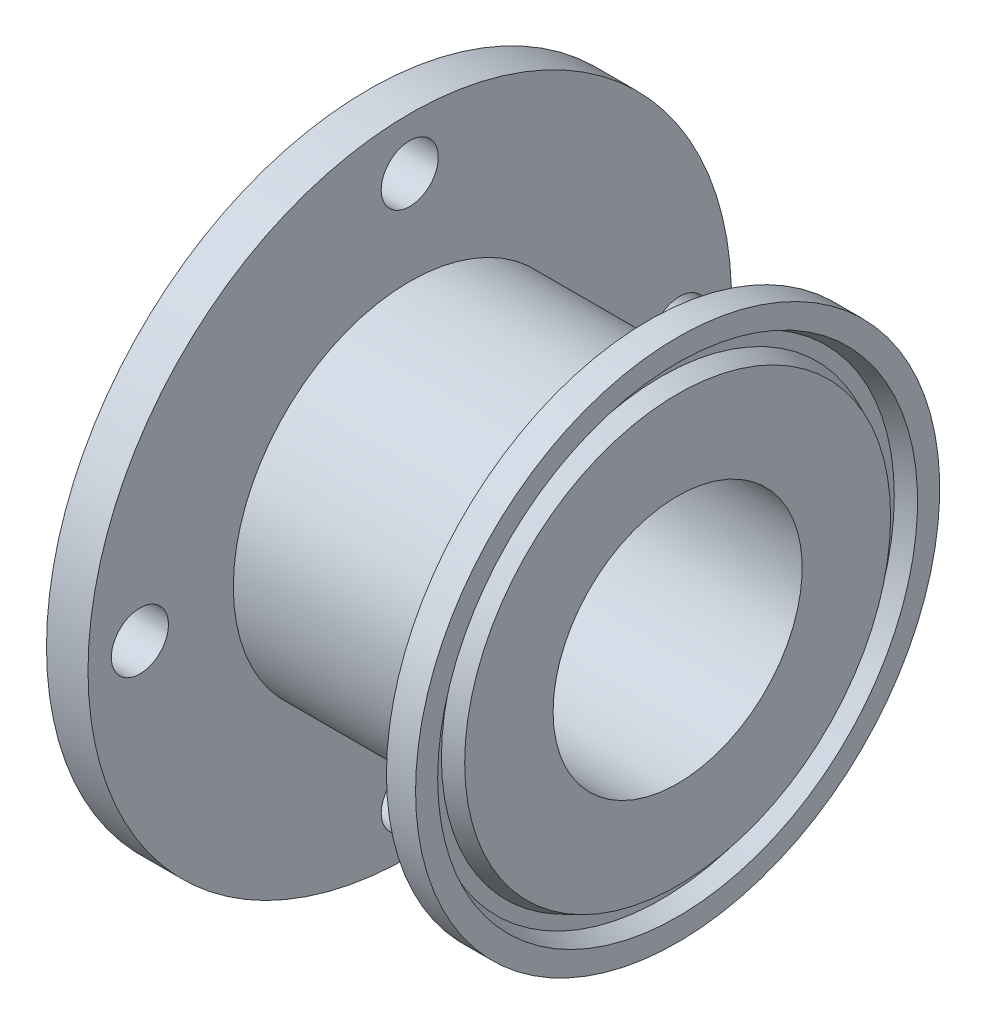
ISO-10303-21;
HEADER;
FILE_DESCRIPTION(('STEP AP214'),'2;1');
FILE_NAME('part.step','',(''),(''),'','','');
FILE_SCHEMA(('AUTOMOTIVE_DESIGN { 1 0 10303 214 1 1 1 1 }'));
ENDSEC;
DATA;
#1=APPLICATION_CONTEXT('core data for automotive mechanical design processes');
#2=APPLICATION_PROTOCOL_DEFINITION('international standard','automotive_design',2000,#1);
#3=PRODUCT_CONTEXT('',#1,'mechanical');
#4=PRODUCT('Part','Part','',(#3));
#5=PRODUCT_RELATED_PRODUCT_CATEGORY('part','',(#4));
#6=PRODUCT_DEFINITION_FORMATION('','',#4);
#7=PRODUCT_DEFINITION_CONTEXT('part definition',#1,'design');
#8=PRODUCT_DEFINITION('design','',#6,#7);
#9=PRODUCT_DEFINITION_SHAPE('','',#8);
#10=(LENGTH_UNIT() NAMED_UNIT(*) SI_UNIT(.MILLI.,.METRE.));
#11=(NAMED_UNIT(*) PLANE_ANGLE_UNIT() SI_UNIT($,.RADIAN.));
#12=(NAMED_UNIT(*) SI_UNIT($,.STERADIAN.) SOLID_ANGLE_UNIT());
#13=UNCERTAINTY_MEASURE_WITH_UNIT(LENGTH_MEASURE(1.E-05),#10,'distance_accuracy_value','');
#14=(GEOMETRIC_REPRESENTATION_CONTEXT(3) GLOBAL_UNCERTAINTY_ASSIGNED_CONTEXT((#13)) GLOBAL_UNIT_ASSIGNED_CONTEXT((#10,
#11,#12)) REPRESENTATION_CONTEXT('',''));
#15=CARTESIAN_POINT('',(0.,0.,0.));
#16=DIRECTION('',(0.,0.,1.));
#17=DIRECTION('',(1.,0.,0.));
#18=AXIS2_PLACEMENT_3D('',#15,#16,#17);
#19=CARTESIAN_POINT('',(-10.9047272163481,31.,0.));
#20=DIRECTION('',(-1.,0.,0.));
#21=DIRECTION('',(0.,0.,1.));
#22=AXIS2_PLACEMENT_3D('',#19,#20,#21);
#23=PLANE('',#22);
#24=CARTESIAN_POINT('',(-10.9047272163481,0.,0.));
#25=DIRECTION('',(-1.,0.,0.));
#26=DIRECTION('',(0.,0.,1.));
#27=AXIS2_PLACEMENT_3D('',#24,#25,#26);
#28=CIRCLE('',#27,31.);
#29=CARTESIAN_POINT('',(-10.9047272163481,0.,31.));
#30=VERTEX_POINT('',#29);
#31=EDGE_CURVE('E76',#30,#30,#28,.T.);
#32=ORIENTED_EDGE('',*,*,#31,.F.);
#33=EDGE_LOOP('',(#32));
#34=FACE_BOUND('',#33,.T.);
#35=CARTESIAN_POINT('',(-10.9047272163481,0.,0.));
#36=DIRECTION('',(-1.,0.,0.));
#37=DIRECTION('',(0.,0.,1.));
#38=AXIS2_PLACEMENT_3D('',#35,#36,#37);
#39=CIRCLE('',#38,17.);
#40=CARTESIAN_POINT('',(-10.9047272163481,0.,17.));
#41=VERTEX_POINT('',#40);
#42=EDGE_CURVE('E73',#41,#41,#39,.T.);
#43=ORIENTED_EDGE('',*,*,#42,.T.);
#44=EDGE_LOOP('',(#43));
#45=FACE_BOUND('',#44,.T.);
#46=CARTESIAN_POINT('',(-10.9047272163481,2.97940280550596E-12,25.9999999999998));
#47=DIRECTION('',(-1.,0.,0.));
#48=DIRECTION('',(0.,0.,1.));
#49=AXIS2_PLACEMENT_3D('',#46,#47,#48);
#50=CIRCLE('',#49,2.74999999999999);
#51=CARTESIAN_POINT('',(-10.9047272163481,2.97940280550596E-12,28.7499999999998));
#52=VERTEX_POINT('',#51);
#53=EDGE_CURVE('E85',#52,#52,#50,.F.);
#54=ORIENTED_EDGE('',*,*,#53,.F.);
#55=EDGE_LOOP('',(#54));
#56=FACE_BOUND('',#55,.T.);
#57=CARTESIAN_POINT('',(-10.9047272163481,-25.9999999999998,2.88862429069604E-12));
#58=DIRECTION('',(-1.,0.,0.));
#59=DIRECTION('',(0.,0.,1.));
#60=AXIS2_PLACEMENT_3D('',#57,#58,#59);
#61=CIRCLE('',#60,2.75);
#62=CARTESIAN_POINT('',(-10.9047272163481,-25.9999999999998,2.75000000000288));
#63=VERTEX_POINT('',#62);
#64=EDGE_CURVE('E89',#63,#63,#61,.F.);
#65=ORIENTED_EDGE('',*,*,#64,.F.);
#66=EDGE_LOOP('',(#65));
#67=FACE_BOUND('',#66,.T.);
#68=CARTESIAN_POINT('',(-10.9047272163481,-2.97940280550596E-12,-25.9999999999998));
#69=DIRECTION('',(-1.,0.,0.));
#70=DIRECTION('',(0.,0.,1.));
#71=AXIS2_PLACEMENT_3D('',#68,#69,#70);
#72=CIRCLE('',#71,2.74999999999999);
#73=CARTESIAN_POINT('',(-10.9047272163481,-2.97940280550596E-12,-23.2499999999998));
#74=VERTEX_POINT('',#73);
#75=EDGE_CURVE('E95',#74,#74,#72,.F.);
#76=ORIENTED_EDGE('',*,*,#75,.F.);
#77=EDGE_LOOP('',(#76));
#78=FACE_BOUND('',#77,.T.);
#79=CARTESIAN_POINT('',(-10.9047272163481,25.9999999999998,-2.70706726107619E-12));
#80=DIRECTION('',(-1.,0.,0.));
#81=DIRECTION('',(0.,0.,1.));
#82=AXIS2_PLACEMENT_3D('',#79,#80,#81);
#83=CIRCLE('',#82,2.75);
#84=CARTESIAN_POINT('',(-10.9047272163481,25.9999999999998,2.74999999999729));
#85=VERTEX_POINT('',#84);
#86=EDGE_CURVE('E101',#85,#85,#83,.F.);
#87=ORIENTED_EDGE('',*,*,#86,.F.);
#88=EDGE_LOOP('',(#87));
#89=FACE_BOUND('',#88,.T.);
#90=ADVANCED_FACE('F38',(#34,#45,#56,#67,#78,#89),#23,.F.);
#91=CARTESIAN_POINT('',(0.,0.,0.));
#92=DIRECTION('',(-1.,0.,0.));
#93=DIRECTION('',(0.,0.,1.));
#94=AXIS2_PLACEMENT_3D('',#91,#92,#93);
#95=CYLINDRICAL_SURFACE('',#94,12.);
#96=CARTESIAN_POINT('',(14.9047272163481,0.,0.));
#97=DIRECTION('',(-1.,0.,0.));
#98=DIRECTION('',(0.,0.,1.));
#99=AXIS2_PLACEMENT_3D('',#96,#97,#98);
#100=CIRCLE('',#99,12.);
#101=CARTESIAN_POINT('',(14.9047272163481,0.,12.));
#102=VERTEX_POINT('',#101);
#103=EDGE_CURVE('E10',#102,#102,#100,.T.);
#104=ORIENTED_EDGE('',*,*,#103,.F.);
#105=EDGE_LOOP('',(#104));
#106=FACE_BOUND('',#105,.T.);
#107=CARTESIAN_POINT('',(-14.9047272163481,0.,0.));
#108=DIRECTION('',(-1.,0.,0.));
#109=DIRECTION('',(0.,0.,1.));
#110=AXIS2_PLACEMENT_3D('',#107,#108,#109);
#111=CIRCLE('',#110,12.);
#112=CARTESIAN_POINT('',(-14.9047272163481,0.,12.));
#113=VERTEX_POINT('',#112);
#114=EDGE_CURVE('E82',#113,#113,#111,.T.);
#115=ORIENTED_EDGE('',*,*,#114,.T.);
#116=EDGE_LOOP('',(#115));
#117=FACE_BOUND('',#116,.T.);
#118=ADVANCED_FACE('F40',(#106,#117),#95,.F.);
#119=CARTESIAN_POINT('',(14.9047272163481,20.5186,0.));
#120=DIRECTION('',(-1.,0.,0.));
#121=DIRECTION('',(0.,0.,1.));
#122=AXIS2_PLACEMENT_3D('',#119,#120,#121);
#123=PLANE('',#122);
#124=CARTESIAN_POINT('',(14.9047272163481,0.,0.));
#125=DIRECTION('',(-1.,0.,0.));
#126=DIRECTION('',(0.,0.,1.));
#127=AXIS2_PLACEMENT_3D('',#124,#125,#126);
#128=CIRCLE('',#127,20.5186);
#129=CARTESIAN_POINT('',(14.9047272163481,0.,20.5186));
#130=VERTEX_POINT('',#129);
#131=EDGE_CURVE('E45',#130,#130,#128,.T.);
#132=ORIENTED_EDGE('',*,*,#131,.F.);
#133=EDGE_LOOP('',(#132));
#134=FACE_BOUND('',#133,.T.);
#135=ORIENTED_EDGE('',*,*,#103,.T.);
#136=EDGE_LOOP('',(#135));
#137=FACE_BOUND('',#136,.T.);
#138=ADVANCED_FACE('F119',(#134,#137),#123,.F.);
#139=CARTESIAN_POINT('',(14.9047272163481,0.,0.));
#140=DIRECTION('',(-1.,0.,0.));
#141=DIRECTION('',(0.,0.,1.));
#142=AXIS2_PLACEMENT_3D('',#139,#140,#141);
#143=CONICAL_SURFACE('',#142,20.5186,0.401425727958693);
#144=CARTESIAN_POINT('',(13.3299272163481,0.,0.));
#145=DIRECTION('',(-1.,0.,0.));
#146=DIRECTION('',(0.,0.,1.));
#147=AXIS2_PLACEMENT_3D('',#144,#145,#146);
#148=CIRCLE('',#147,21.1870629405669);
#149=CARTESIAN_POINT('',(13.3299272163481,0.,21.1870629405669));
#150=VERTEX_POINT('',#149);
#151=EDGE_CURVE('E49',#150,#150,#148,.T.);
#152=ORIENTED_EDGE('',*,*,#151,.F.);
#153=EDGE_LOOP('',(#152));
#154=FACE_BOUND('',#153,.T.);
#155=ORIENTED_EDGE('',*,*,#131,.T.);
#156=EDGE_LOOP('',(#155));
#157=FACE_BOUND('',#156,.T.);
#158=ADVANCED_FACE('F154',(#154,#157),#143,.T.);
#159=CARTESIAN_POINT('',(13.3299272163481,22.4501370594331,0.));
#160=DIRECTION('',(-1.,0.,0.));
#161=DIRECTION('',(0.,0.,1.));
#162=AXIS2_PLACEMENT_3D('',#159,#160,#161);
#163=PLANE('',#162);
#164=CARTESIAN_POINT('',(13.3299272163481,0.,0.));
#165=DIRECTION('',(-1.,0.,0.));
#166=DIRECTION('',(0.,0.,1.));
#167=AXIS2_PLACEMENT_3D('',#164,#165,#166);
#168=CIRCLE('',#167,22.4501370594331);
#169=CARTESIAN_POINT('',(13.3299272163481,0.,22.4501370594331));
#170=VERTEX_POINT('',#169);
#171=EDGE_CURVE('E53',#170,#170,#168,.T.);
#172=ORIENTED_EDGE('',*,*,#171,.F.);
#173=EDGE_LOOP('',(#172));
#174=FACE_BOUND('',#173,.T.);
#175=ORIENTED_EDGE('',*,*,#151,.T.);
#176=EDGE_LOOP('',(#175));
#177=FACE_BOUND('',#176,.T.);
#178=ADVANCED_FACE('F150',(#174,#177),#163,.F.);
#179=CARTESIAN_POINT('',(13.3299272163481,0.,0.));
#180=DIRECTION('',(1.,0.,0.));
#181=DIRECTION('',(0.,0.,-1.));
#182=AXIS2_PLACEMENT_3D('',#179,#180,#181);
#183=CONICAL_SURFACE('',#182,22.4501370594331,0.401425727958693);
#184=CARTESIAN_POINT('',(14.9047272163481,0.,0.));
#185=DIRECTION('',(-1.,0.,0.));
#186=DIRECTION('',(0.,0.,1.));
#187=AXIS2_PLACEMENT_3D('',#184,#185,#186);
#188=CIRCLE('',#187,23.1186);
#189=CARTESIAN_POINT('',(14.9047272163481,0.,23.1186));
#190=VERTEX_POINT('',#189);
#191=EDGE_CURVE('E58',#190,#190,#188,.T.);
#192=ORIENTED_EDGE('',*,*,#191,.F.);
#193=EDGE_LOOP('',(#192));
#194=FACE_BOUND('',#193,.T.);
#195=ORIENTED_EDGE('',*,*,#171,.T.);
#196=EDGE_LOOP('',(#195));
#197=FACE_BOUND('',#196,.T.);
#198=ADVANCED_FACE('F146',(#194,#197),#183,.F.);
#199=CARTESIAN_POINT('',(14.9047272163481,25.25,0.));
#200=DIRECTION('',(-1.,0.,0.));
#201=DIRECTION('',(0.,0.,1.));
#202=AXIS2_PLACEMENT_3D('',#199,#200,#201);
#203=PLANE('',#202);
#204=CARTESIAN_POINT('',(14.9047272163481,0.,0.));
#205=DIRECTION('',(-1.,0.,0.));
#206=DIRECTION('',(0.,0.,1.));
#207=AXIS2_PLACEMENT_3D('',#204,#205,#206);
#208=CIRCLE('',#207,25.25);
#209=CARTESIAN_POINT('',(14.9047272163481,0.,25.25));
#210=VERTEX_POINT('',#209);
#211=EDGE_CURVE('E61',#210,#210,#208,.T.);
#212=ORIENTED_EDGE('',*,*,#211,.F.);
#213=EDGE_LOOP('',(#212));
#214=FACE_BOUND('',#213,.T.);
#215=ORIENTED_EDGE('',*,*,#191,.T.);
#216=EDGE_LOOP('',(#215));
#217=FACE_BOUND('',#216,.T.);
#218=ADVANCED_FACE('F142',(#214,#217),#203,.F.);
#219=CARTESIAN_POINT('',(0.,0.,0.));
#220=DIRECTION('',(-1.,0.,0.));
#221=DIRECTION('',(0.,0.,1.));
#222=AXIS2_PLACEMENT_3D('',#219,#220,#221);
#223=CYLINDRICAL_SURFACE('',#222,25.25);
#224=CARTESIAN_POINT('',(12.0980272163481,0.,0.));
#225=DIRECTION('',(-1.,0.,0.));
#226=DIRECTION('',(0.,0.,1.));
#227=AXIS2_PLACEMENT_3D('',#224,#225,#226);
#228=CIRCLE('',#227,25.25);
#229=CARTESIAN_POINT('',(12.0980272163481,0.,25.25));
#230=VERTEX_POINT('',#229);
#231=EDGE_CURVE('E64',#230,#230,#228,.T.);
#232=ORIENTED_EDGE('',*,*,#231,.F.);
#233=EDGE_LOOP('',(#232));
#234=FACE_BOUND('',#233,.T.);
#235=ORIENTED_EDGE('',*,*,#211,.T.);
#236=EDGE_LOOP('',(#235));
#237=FACE_BOUND('',#236,.T.);
#238=ADVANCED_FACE('F138',(#234,#237),#223,.T.);
#239=CARTESIAN_POINT('',(12.0980272163481,0.,0.));
#240=DIRECTION('',(1.,0.,0.));
#241=DIRECTION('',(0.,0.,-1.));
#242=AXIS2_PLACEMENT_3D('',#239,#240,#241);
#243=CONICAL_SURFACE('',#242,25.25,1.22173047639604);
#244=CARTESIAN_POINT('',(9.36900423303654,0.,0.));
#245=DIRECTION('',(-1.,0.,0.));
#246=DIRECTION('',(0.,0.,1.));
#247=AXIS2_PLACEMENT_3D('',#244,#245,#246);
#248=CIRCLE('',#247,17.7520709761788);
#249=CARTESIAN_POINT('',(9.36900423303654,0.,17.7520709761788));
#250=VERTEX_POINT('',#249);
#251=EDGE_CURVE('E67',#250,#250,#248,.T.);
#252=ORIENTED_EDGE('',*,*,#251,.F.);
#253=EDGE_LOOP('',(#252));
#254=FACE_BOUND('',#253,.T.);
#255=ORIENTED_EDGE('',*,*,#231,.T.);
#256=EDGE_LOOP('',(#255));
#257=FACE_BOUND('',#256,.T.);
#258=ADVANCED_FACE('F134',(#254,#257),#243,.T.);
#259=CARTESIAN_POINT('',(8.29493556747824,0.,0.));
#260=DIRECTION('',(-1.,0.,0.));
#261=DIRECTION('',(0.,0.,1.));
#262=AXIS2_PLACEMENT_3D('',#259,#260,#261);
#263=TOROIDAL_SURFACE('',#262,18.143,1.143);
#264=CARTESIAN_POINT('',(8.29493556747824,0.,0.));
#265=DIRECTION('',(-1.,0.,0.));
#266=DIRECTION('',(0.,0.,1.));
#267=AXIS2_PLACEMENT_3D('',#264,#265,#266);
#268=CIRCLE('',#267,17.);
#269=CARTESIAN_POINT('',(8.29493556747824,0.,17.));
#270=VERTEX_POINT('',#269);
#271=EDGE_CURVE('E70',#270,#270,#268,.T.);
#272=ORIENTED_EDGE('',*,*,#271,.F.);
#273=EDGE_LOOP('',(#272));
#274=FACE_BOUND('',#273,.T.);
#275=ORIENTED_EDGE('',*,*,#251,.T.);
#276=EDGE_LOOP('',(#275));
#277=FACE_BOUND('',#276,.T.);
#278=ADVANCED_FACE('F130',(#274,#277),#263,.F.);
#279=CARTESIAN_POINT('',(0.,0.,0.));
#280=DIRECTION('',(-1.,0.,0.));
#281=DIRECTION('',(0.,0.,1.));
#282=AXIS2_PLACEMENT_3D('',#279,#280,#281);
#283=CYLINDRICAL_SURFACE('',#282,17.);
#284=ORIENTED_EDGE('',*,*,#42,.F.);
#285=EDGE_LOOP('',(#284));
#286=FACE_BOUND('',#285,.T.);
#287=ORIENTED_EDGE('',*,*,#271,.T.);
#288=EDGE_LOOP('',(#287));
#289=FACE_BOUND('',#288,.T.);
#290=ADVANCED_FACE('F127',(#286,#289),#283,.T.);
#291=CARTESIAN_POINT('',(0.,0.,0.));
#292=DIRECTION('',(-1.,0.,0.));
#293=DIRECTION('',(0.,0.,1.));
#294=AXIS2_PLACEMENT_3D('',#291,#292,#293);
#295=CYLINDRICAL_SURFACE('',#294,31.);
#296=CARTESIAN_POINT('',(-14.9047272163481,0.,0.));
#297=DIRECTION('',(-1.,0.,0.));
#298=DIRECTION('',(0.,0.,1.));
#299=AXIS2_PLACEMENT_3D('',#296,#297,#298);
#300=CIRCLE('',#299,31.);
#301=CARTESIAN_POINT('',(-14.9047272163481,0.,31.));
#302=VERTEX_POINT('',#301);
#303=EDGE_CURVE('E79',#302,#302,#300,.T.);
#304=ORIENTED_EDGE('',*,*,#303,.F.);
#305=EDGE_LOOP('',(#304));
#306=FACE_BOUND('',#305,.T.);
#307=ORIENTED_EDGE('',*,*,#31,.T.);
#308=EDGE_LOOP('',(#307));
#309=FACE_BOUND('',#308,.T.);
#310=ADVANCED_FACE('F125',(#306,#309),#295,.T.);
#311=CARTESIAN_POINT('',(-14.9047272163481,12.,0.));
#312=DIRECTION('',(1.,0.,0.));
#313=DIRECTION('',(0.,0.,-1.));
#314=AXIS2_PLACEMENT_3D('',#311,#312,#313);
#315=PLANE('',#314);
#316=CARTESIAN_POINT('',(-14.9047272163481,25.9999999999998,-2.70706726107619E-12));
#317=DIRECTION('',(-1.,0.,0.));
#318=DIRECTION('',(0.,0.,1.));
#319=AXIS2_PLACEMENT_3D('',#316,#317,#318);
#320=CIRCLE('',#319,2.74999999999999);
#321=CARTESIAN_POINT('',(-14.9047272163481,25.9999999999998,2.74999999999728));
#322=VERTEX_POINT('',#321);
#323=EDGE_CURVE('E104',#322,#322,#320,.T.);
#324=ORIENTED_EDGE('',*,*,#323,.F.);
#325=EDGE_LOOP('',(#324));
#326=FACE_BOUND('',#325,.T.);
#327=CARTESIAN_POINT('',(-14.9047272163481,-2.97940280550596E-12,-25.9999999999998));
#328=DIRECTION('',(-1.,0.,0.));
#329=DIRECTION('',(0.,0.,1.));
#330=AXIS2_PLACEMENT_3D('',#327,#328,#329);
#331=CIRCLE('',#330,2.74999999999999);
#332=CARTESIAN_POINT('',(-14.9047272163481,-2.97940280550596E-12,-23.2499999999998));
#333=VERTEX_POINT('',#332);
#334=EDGE_CURVE('E98',#333,#333,#331,.T.);
#335=ORIENTED_EDGE('',*,*,#334,.F.);
#336=EDGE_LOOP('',(#335));
#337=FACE_BOUND('',#336,.T.);
#338=CARTESIAN_POINT('',(-14.9047272163481,-25.9999999999998,2.88862429069604E-12));
#339=DIRECTION('',(-1.,0.,0.));
#340=DIRECTION('',(0.,0.,1.));
#341=AXIS2_PLACEMENT_3D('',#338,#339,#340);
#342=CIRCLE('',#341,2.74999999999999);
#343=CARTESIAN_POINT('',(-14.9047272163481,-25.9999999999998,2.75000000000288));
#344=VERTEX_POINT('',#343);
#345=EDGE_CURVE('E92',#344,#344,#342,.T.);
#346=ORIENTED_EDGE('',*,*,#345,.F.);
#347=EDGE_LOOP('',(#346));
#348=FACE_BOUND('',#347,.T.);
#349=CARTESIAN_POINT('',(-14.9047272163481,2.97940280550596E-12,25.9999999999998));
#350=DIRECTION('',(-1.,0.,0.));
#351=DIRECTION('',(0.,0.,1.));
#352=AXIS2_PLACEMENT_3D('',#349,#350,#351);
#353=CIRCLE('',#352,2.74999999999999);
#354=CARTESIAN_POINT('',(-14.9047272163481,2.97940280550596E-12,28.7499999999998));
#355=VERTEX_POINT('',#354);
#356=EDGE_CURVE('E86',#355,#355,#353,.T.);
#357=ORIENTED_EDGE('',*,*,#356,.F.);
#358=EDGE_LOOP('',(#357));
#359=FACE_BOUND('',#358,.T.);
#360=ORIENTED_EDGE('',*,*,#114,.F.);
#361=EDGE_LOOP('',(#360));
#362=FACE_BOUND('',#361,.T.);
#363=ORIENTED_EDGE('',*,*,#303,.T.);
#364=EDGE_LOOP('',(#363));
#365=FACE_BOUND('',#364,.T.);
#366=ADVANCED_FACE('F202',(#326,#337,#348,#359,#362,#365),#315,.F.);
#367=CARTESIAN_POINT('',(-14.9047272163481,2.97940280550596E-12,25.9999999999998));
#368=DIRECTION('',(-1.,0.,0.));
#369=DIRECTION('',(0.,0.,1.));
#370=AXIS2_PLACEMENT_3D('',#367,#368,#369);
#371=CYLINDRICAL_SURFACE('',#370,2.74999999999999);
#372=ORIENTED_EDGE('',*,*,#53,.T.);
#373=EDGE_LOOP('',(#372));
#374=FACE_BOUND('',#373,.T.);
#375=ORIENTED_EDGE('',*,*,#356,.T.);
#376=EDGE_LOOP('',(#375));
#377=FACE_BOUND('',#376,.T.);
#378=ADVANCED_FACE('F209',(#374,#377),#371,.F.);
#379=CARTESIAN_POINT('',(-14.9047272163481,-25.9999999999998,2.88862429069604E-12));
#380=DIRECTION('',(-1.,0.,0.));
#381=DIRECTION('',(0.,0.,1.));
#382=AXIS2_PLACEMENT_3D('',#379,#380,#381);
#383=CYLINDRICAL_SURFACE('',#382,2.75);
#384=ORIENTED_EDGE('',*,*,#64,.T.);
#385=EDGE_LOOP('',(#384));
#386=FACE_BOUND('',#385,.T.);
#387=ORIENTED_EDGE('',*,*,#345,.T.);
#388=EDGE_LOOP('',(#387));
#389=FACE_BOUND('',#388,.T.);
#390=ADVANCED_FACE('F216',(#386,#389),#383,.F.);
#391=CARTESIAN_POINT('',(-14.9047272163481,-2.97940280550596E-12,-25.9999999999998));
#392=DIRECTION('',(-1.,0.,0.));
#393=DIRECTION('',(0.,0.,1.));
#394=AXIS2_PLACEMENT_3D('',#391,#392,#393);
#395=CYLINDRICAL_SURFACE('',#394,2.74999999999999);
#396=ORIENTED_EDGE('',*,*,#75,.T.);
#397=EDGE_LOOP('',(#396));
#398=FACE_BOUND('',#397,.T.);
#399=ORIENTED_EDGE('',*,*,#334,.T.);
#400=EDGE_LOOP('',(#399));
#401=FACE_BOUND('',#400,.T.);
#402=ADVANCED_FACE('F224',(#398,#401),#395,.F.);
#403=CARTESIAN_POINT('',(-14.9047272163481,25.9999999999998,-2.70706726107619E-12));
#404=DIRECTION('',(-1.,0.,0.));
#405=DIRECTION('',(0.,0.,1.));
#406=AXIS2_PLACEMENT_3D('',#403,#404,#405);
#407=CYLINDRICAL_SURFACE('',#406,2.75);
#408=ORIENTED_EDGE('',*,*,#86,.T.);
#409=EDGE_LOOP('',(#408));
#410=FACE_BOUND('',#409,.T.);
#411=ORIENTED_EDGE('',*,*,#323,.T.);
#412=EDGE_LOOP('',(#411));
#413=FACE_BOUND('',#412,.T.);
#414=ADVANCED_FACE('F110',(#410,#413),#407,.F.);
#415=CLOSED_SHELL('',(#90,#118,#138,#158,#178,#198,#218,#238,#258,#278,#290,#310,#366,#378,#390,
#402,#414));
#416=MANIFOLD_SOLID_BREP('B2',#415);
#417=ADVANCED_BREP_SHAPE_REPRESENTATION('',(#18,#416),#14);
#418=SHAPE_DEFINITION_REPRESENTATION(#9,#417);
ENDSEC;
END-ISO-10303-21;
